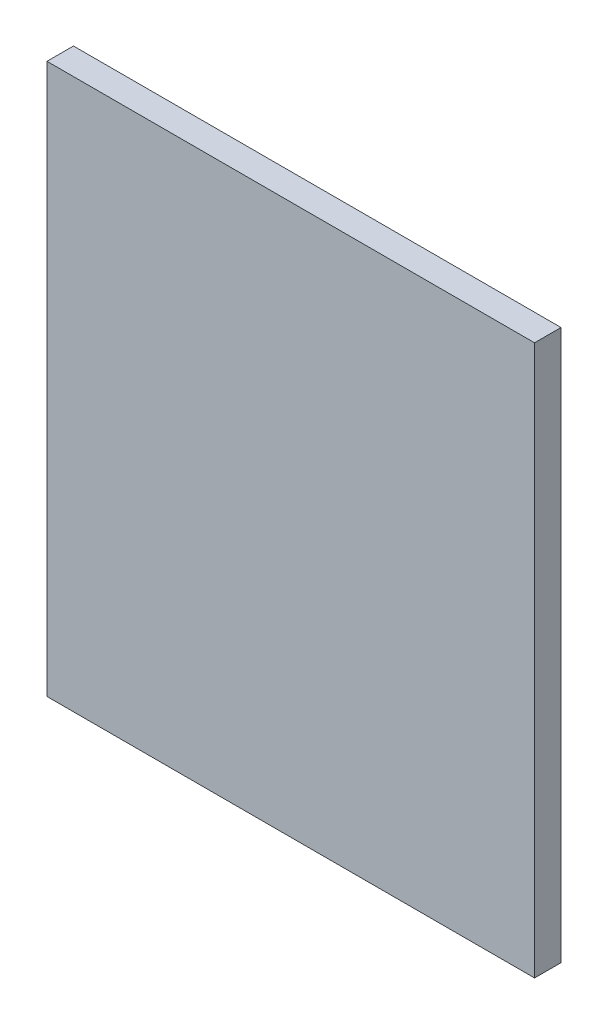
ISO-10303-21;
HEADER;
FILE_DESCRIPTION(('STEP AP214'),'2;1');
FILE_NAME('part.step','',(''),(''),'','','');
FILE_SCHEMA(('AUTOMOTIVE_DESIGN { 1 0 10303 214 1 1 1 1 }'));
ENDSEC;
DATA;
#1=APPLICATION_CONTEXT('core data for automotive mechanical design processes');
#2=APPLICATION_PROTOCOL_DEFINITION('international standard','automotive_design',2000,#1);
#3=PRODUCT_CONTEXT('',#1,'mechanical');
#4=PRODUCT('Part','Part','',(#3));
#5=PRODUCT_RELATED_PRODUCT_CATEGORY('part','',(#4));
#6=PRODUCT_DEFINITION_FORMATION('','',#4);
#7=PRODUCT_DEFINITION_CONTEXT('part definition',#1,'design');
#8=PRODUCT_DEFINITION('design','',#6,#7);
#9=PRODUCT_DEFINITION_SHAPE('','',#8);
#10=(LENGTH_UNIT() NAMED_UNIT(*) SI_UNIT(.MILLI.,.METRE.));
#11=(NAMED_UNIT(*) PLANE_ANGLE_UNIT() SI_UNIT($,.RADIAN.));
#12=(NAMED_UNIT(*) SI_UNIT($,.STERADIAN.) SOLID_ANGLE_UNIT());
#13=UNCERTAINTY_MEASURE_WITH_UNIT(LENGTH_MEASURE(1.E-05),#10,'distance_accuracy_value','');
#14=(GEOMETRIC_REPRESENTATION_CONTEXT(3) GLOBAL_UNCERTAINTY_ASSIGNED_CONTEXT((#13)) GLOBAL_UNIT_ASSIGNED_CONTEXT((#10,
#11,#12)) REPRESENTATION_CONTEXT('',''));
#15=CARTESIAN_POINT('',(0.,0.,0.));
#16=DIRECTION('',(0.,0.,1.));
#17=DIRECTION('',(1.,0.,0.));
#18=AXIS2_PLACEMENT_3D('',#15,#16,#17);
#19=CARTESIAN_POINT('',(-813.199980509765,428.111928327645,60.));
#20=DIRECTION('',(1.,0.,0.));
#21=DIRECTION('',(0.,1.,0.));
#22=AXIS2_PLACEMENT_3D('',#19,#20,#21);
#23=PLANE('',#22);
#24=DIRECTION('',(0.,-1.,0.));
#25=VECTOR('',#24,1.);
#26=CARTESIAN_POINT('',(-813.199980509765,428.111928327645,0.));
#27=LINE('',#26,#25);
#28=CARTESIAN_POINT('',(-813.199980509765,428.111928327645,0.));
#29=VERTEX_POINT('',#28);
#30=CARTESIAN_POINT('',(-813.199980509765,-818.118071672355,0.));
#31=VERTEX_POINT('',#30);
#32=EDGE_CURVE('E96',#29,#31,#27,.T.);
#33=ORIENTED_EDGE('',*,*,#32,.T.);
#34=DIRECTION('',(0.,0.,-1.));
#35=VECTOR('',#34,1.);
#36=CARTESIAN_POINT('',(-813.199980509765,-818.118071672355,60.));
#37=LINE('',#36,#35);
#38=CARTESIAN_POINT('',(-813.199980509765,-818.118071672355,60.));
#39=VERTEX_POINT('',#38);
#40=EDGE_CURVE('E11',#39,#31,#37,.T.);
#41=ORIENTED_EDGE('',*,*,#40,.F.);
#42=DIRECTION('',(0.,-1.,0.));
#43=VECTOR('',#42,1.);
#44=CARTESIAN_POINT('',(-813.199980509765,428.111928327645,60.));
#45=LINE('',#44,#43);
#46=CARTESIAN_POINT('',(-813.199980509765,428.111928327645,60.));
#47=VERTEX_POINT('',#46);
#48=EDGE_CURVE('E84',#47,#39,#45,.T.);
#49=ORIENTED_EDGE('',*,*,#48,.F.);
#50=DIRECTION('',(0.,0.,-1.));
#51=VECTOR('',#50,1.);
#52=CARTESIAN_POINT('',(-813.199980509765,428.111928327645,60.));
#53=LINE('',#52,#51);
#54=EDGE_CURVE('E92',#47,#29,#53,.T.);
#55=ORIENTED_EDGE('',*,*,#54,.T.);
#56=EDGE_LOOP('',(#33,#41,#49,#55));
#57=FACE_BOUND('',#56,.T.);
#58=ADVANCED_FACE('F33',(#57),#23,.F.);
#59=CARTESIAN_POINT('',(-813.199980509765,-818.118071672355,60.));
#60=DIRECTION('',(0.,1.,0.));
#61=DIRECTION('',(0.,0.,1.));
#62=AXIS2_PLACEMENT_3D('',#59,#60,#61);
#63=PLANE('',#62);
#64=DIRECTION('',(1.,0.,0.));
#65=VECTOR('',#64,1.);
#66=CARTESIAN_POINT('',(-813.199980509765,-818.118071672355,0.));
#67=LINE('',#66,#65);
#68=CARTESIAN_POINT('',(291.35334369272,-818.118071672355,0.));
#69=VERTEX_POINT('',#68);
#70=EDGE_CURVE('E88',#31,#69,#67,.T.);
#71=ORIENTED_EDGE('',*,*,#70,.T.);
#72=DIRECTION('',(0.,0.,-1.));
#73=VECTOR('',#72,1.);
#74=CARTESIAN_POINT('',(291.35334369272,-818.118071672355,60.));
#75=LINE('',#74,#73);
#76=CARTESIAN_POINT('',(291.35334369272,-818.118071672355,60.));
#77=VERTEX_POINT('',#76);
#78=EDGE_CURVE('E41',#77,#69,#75,.T.);
#79=ORIENTED_EDGE('',*,*,#78,.F.);
#80=DIRECTION('',(1.,0.,0.));
#81=VECTOR('',#80,1.);
#82=CARTESIAN_POINT('',(-813.199980509765,-818.118071672355,60.));
#83=LINE('',#82,#81);
#84=EDGE_CURVE('E79',#39,#77,#83,.T.);
#85=ORIENTED_EDGE('',*,*,#84,.F.);
#86=ORIENTED_EDGE('',*,*,#40,.T.);
#87=EDGE_LOOP('',(#71,#79,#85,#86));
#88=FACE_BOUND('',#87,.T.);
#89=ADVANCED_FACE('F87',(#88),#63,.F.);
#90=CARTESIAN_POINT('',(291.353343692719,428.111928327645,60.));
#91=DIRECTION('',(-1.,0.,0.));
#92=DIRECTION('',(0.,-1.,0.));
#93=AXIS2_PLACEMENT_3D('',#90,#91,#92);
#94=PLANE('',#93);
#95=DIRECTION('',(0.,1.,0.));
#96=VECTOR('',#95,1.);
#97=CARTESIAN_POINT('',(291.353343692719,428.111928327645,0.));
#98=LINE('',#97,#96);
#99=CARTESIAN_POINT('',(291.353343692719,428.111928327645,0.));
#100=VERTEX_POINT('',#99);
#101=EDGE_CURVE('E66',#69,#100,#98,.T.);
#102=ORIENTED_EDGE('',*,*,#101,.T.);
#103=DIRECTION('',(0.,0.,-1.));
#104=VECTOR('',#103,1.);
#105=CARTESIAN_POINT('',(291.353343692719,428.111928327645,60.));
#106=LINE('',#105,#104);
#107=CARTESIAN_POINT('',(291.353343692719,428.111928327645,60.));
#108=VERTEX_POINT('',#107);
#109=EDGE_CURVE('E89',#108,#100,#106,.T.);
#110=ORIENTED_EDGE('',*,*,#109,.F.);
#111=DIRECTION('',(0.,1.,0.));
#112=VECTOR('',#111,1.);
#113=CARTESIAN_POINT('',(291.353343692719,428.111928327645,60.));
#114=LINE('',#113,#112);
#115=EDGE_CURVE('E82',#77,#108,#114,.T.);
#116=ORIENTED_EDGE('',*,*,#115,.F.);
#117=ORIENTED_EDGE('',*,*,#78,.T.);
#118=EDGE_LOOP('',(#102,#110,#116,#117));
#119=FACE_BOUND('',#118,.T.);
#120=ADVANCED_FACE('F90',(#119),#94,.F.);
#121=CARTESIAN_POINT('',(-813.199980509765,428.111928327645,60.));
#122=DIRECTION('',(0.,-1.,0.));
#123=DIRECTION('',(0.,0.,-1.));
#124=AXIS2_PLACEMENT_3D('',#121,#122,#123);
#125=PLANE('',#124);
#126=DIRECTION('',(-1.,0.,0.));
#127=VECTOR('',#126,1.);
#128=CARTESIAN_POINT('',(-813.199980509765,428.111928327645,0.));
#129=LINE('',#128,#127);
#130=EDGE_CURVE('E72',#100,#29,#129,.T.);
#131=ORIENTED_EDGE('',*,*,#130,.T.);
#132=ORIENTED_EDGE('',*,*,#54,.F.);
#133=DIRECTION('',(-1.,0.,0.));
#134=VECTOR('',#133,1.);
#135=CARTESIAN_POINT('',(-813.199980509765,428.111928327645,60.));
#136=LINE('',#135,#134);
#137=EDGE_CURVE('E49',#108,#47,#136,.T.);
#138=ORIENTED_EDGE('',*,*,#137,.F.);
#139=ORIENTED_EDGE('',*,*,#109,.T.);
#140=EDGE_LOOP('',(#131,#132,#138,#139));
#141=FACE_BOUND('',#140,.T.);
#142=ADVANCED_FACE('F103',(#141),#125,.F.);
#143=CARTESIAN_POINT('',(0.,0.,60.));
#144=DIRECTION('',(0.,0.,1.));
#145=DIRECTION('',(1.,0.,0.));
#146=AXIS2_PLACEMENT_3D('',#143,#144,#145);
#147=PLANE('',#146);
#148=ORIENTED_EDGE('',*,*,#48,.T.);
#149=ORIENTED_EDGE('',*,*,#84,.T.);
#150=ORIENTED_EDGE('',*,*,#115,.T.);
#151=ORIENTED_EDGE('',*,*,#137,.T.);
#152=EDGE_LOOP('',(#148,#149,#150,#151));
#153=FACE_BOUND('',#152,.T.);
#154=ADVANCED_FACE('F80',(#153),#147,.T.);
#155=CARTESIAN_POINT('',(0.,0.,0.));
#156=DIRECTION('',(0.,0.,1.));
#157=DIRECTION('',(1.,0.,0.));
#158=AXIS2_PLACEMENT_3D('',#155,#156,#157);
#159=PLANE('',#158);
#160=ORIENTED_EDGE('',*,*,#32,.F.);
#161=ORIENTED_EDGE('',*,*,#130,.F.);
#162=ORIENTED_EDGE('',*,*,#101,.F.);
#163=ORIENTED_EDGE('',*,*,#70,.F.);
#164=EDGE_LOOP('',(#160,#161,#162,#163));
#165=FACE_BOUND('',#164,.T.);
#166=ADVANCED_FACE('F106',(#165),#159,.F.);
#167=CLOSED_SHELL('',(#58,#89,#120,#142,#154,#166));
#168=MANIFOLD_SOLID_BREP('B2',#167);
#169=ADVANCED_BREP_SHAPE_REPRESENTATION('',(#18,#168),#14);
#170=SHAPE_DEFINITION_REPRESENTATION(#9,#169);
ENDSEC;
END-ISO-10303-21;
